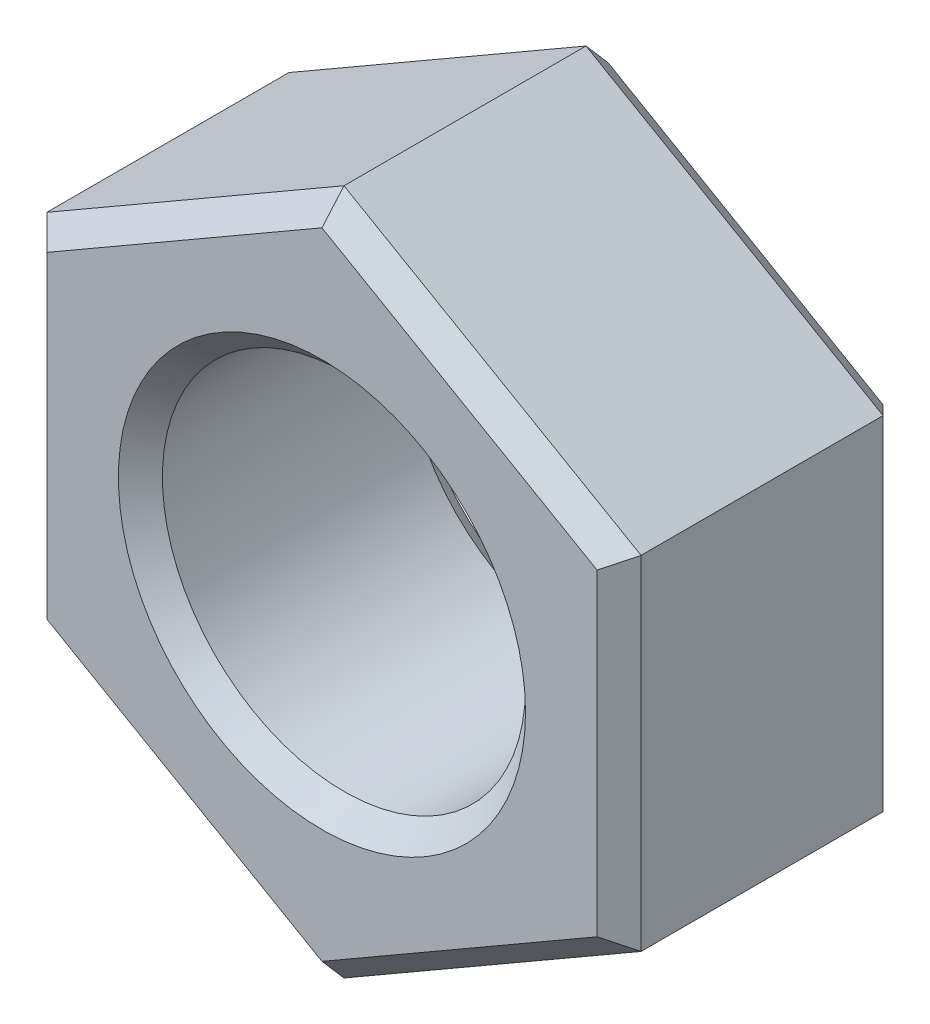
ISO-10303-21;
HEADER;
FILE_DESCRIPTION(('STEP AP214'),'2;1');
FILE_NAME('part.step','',(''),(''),'','','');
FILE_SCHEMA(('AUTOMOTIVE_DESIGN { 1 0 10303 214 1 1 1 1 }'));
ENDSEC;
DATA;
#1=APPLICATION_CONTEXT('core data for automotive mechanical design processes');
#2=APPLICATION_PROTOCOL_DEFINITION('international standard','automotive_design',2000,#1);
#3=PRODUCT_CONTEXT('',#1,'mechanical');
#4=PRODUCT('Part','Part','',(#3));
#5=PRODUCT_RELATED_PRODUCT_CATEGORY('part','',(#4));
#6=PRODUCT_DEFINITION_FORMATION('','',#4);
#7=PRODUCT_DEFINITION_CONTEXT('part definition',#1,'design');
#8=PRODUCT_DEFINITION('design','',#6,#7);
#9=PRODUCT_DEFINITION_SHAPE('','',#8);
#10=(LENGTH_UNIT() NAMED_UNIT(*) SI_UNIT(.MILLI.,.METRE.));
#11=(NAMED_UNIT(*) PLANE_ANGLE_UNIT() SI_UNIT($,.RADIAN.));
#12=(NAMED_UNIT(*) SI_UNIT($,.STERADIAN.) SOLID_ANGLE_UNIT());
#13=UNCERTAINTY_MEASURE_WITH_UNIT(LENGTH_MEASURE(1.E-05),#10,'distance_accuracy_value','');
#14=(GEOMETRIC_REPRESENTATION_CONTEXT(3) GLOBAL_UNCERTAINTY_ASSIGNED_CONTEXT((#13)) GLOBAL_UNIT_ASSIGNED_CONTEXT((#10,
#11,#12)) REPRESENTATION_CONTEXT('',''));
#15=CARTESIAN_POINT('',(0.,0.,0.));
#16=DIRECTION('',(0.,0.,1.));
#17=DIRECTION('',(1.,0.,0.));
#18=AXIS2_PLACEMENT_3D('',#15,#16,#17);
#19=CARTESIAN_POINT('',(0.,0.,1.3));
#20=DIRECTION('',(0.,0.,1.));
#21=DIRECTION('',(1.,0.,0.));
#22=AXIS2_PLACEMENT_3D('',#19,#20,#21);
#23=PLANE('',#22);
#24=CARTESIAN_POINT('',(0.,0.,1.3));
#25=DIRECTION('',(0.,0.,1.));
#26=DIRECTION('',(1.,0.,0.));
#27=AXIS2_PLACEMENT_3D('',#24,#25,#26);
#28=CIRCLE('',#27,1.85);
#29=CARTESIAN_POINT('',(1.85,0.,1.3));
#30=VERTEX_POINT('',#29);
#31=EDGE_CURVE('E11',#30,#30,#28,.F.);
#32=ORIENTED_EDGE('',*,*,#31,.T.);
#33=EDGE_LOOP('',(#32));
#34=FACE_BOUND('',#33,.T.);
#35=DIRECTION('',(0.,-1.,0.));
#36=VECTOR('',#35,1.);
#37=CARTESIAN_POINT('',(-2.5,-1.55884572681199,1.3));
#38=LINE('',#37,#36);
#39=CARTESIAN_POINT('',(-2.5,1.44337567297406,1.3));
#40=VERTEX_POINT('',#39);
#41=CARTESIAN_POINT('',(-2.5,-1.44337567297407,1.3));
#42=VERTEX_POINT('',#41);
#43=EDGE_CURVE('E61',#40,#42,#38,.T.);
#44=ORIENTED_EDGE('',*,*,#43,.T.);
#45=DIRECTION('',(0.866025403784439,-0.5,0.));
#46=VECTOR('',#45,1.);
#47=CARTESIAN_POINT('',(0.0999999999999997,-2.94448637286709,1.3));
#48=LINE('',#47,#46);
#49=CARTESIAN_POINT('',(0.,-2.88675134594813,1.3));
#50=VERTEX_POINT('',#49);
#51=EDGE_CURVE('E53',#42,#50,#48,.T.);
#52=ORIENTED_EDGE('',*,*,#51,.T.);
#53=DIRECTION('',(0.866025403784439,0.5,0.));
#54=VECTOR('',#53,1.);
#55=CARTESIAN_POINT('',(2.6,-1.3856406460551,1.3));
#56=LINE('',#55,#54);
#57=CARTESIAN_POINT('',(2.5,-1.44337567297406,1.3));
#58=VERTEX_POINT('',#57);
#59=EDGE_CURVE('E221',#50,#58,#56,.T.);
#60=ORIENTED_EDGE('',*,*,#59,.T.);
#61=DIRECTION('',(0.,1.,0.));
#62=VECTOR('',#61,1.);
#63=CARTESIAN_POINT('',(2.5,1.55884572681199,1.3));
#64=LINE('',#63,#62);
#65=CARTESIAN_POINT('',(2.5,1.44337567297407,1.3));
#66=VERTEX_POINT('',#65);
#67=EDGE_CURVE('E223',#58,#66,#64,.T.);
#68=ORIENTED_EDGE('',*,*,#67,.T.);
#69=DIRECTION('',(-0.866025403784439,0.5,0.));
#70=VECTOR('',#69,1.);
#71=CARTESIAN_POINT('',(-0.100000000000001,2.94448637286709,1.3));
#72=LINE('',#71,#70);
#73=CARTESIAN_POINT('',(0.,2.88675134594813,1.3));
#74=VERTEX_POINT('',#73);
#75=EDGE_CURVE('E226',#66,#74,#72,.T.);
#76=ORIENTED_EDGE('',*,*,#75,.T.);
#77=DIRECTION('',(-0.866025403784439,-0.5,0.));
#78=VECTOR('',#77,1.);
#79=CARTESIAN_POINT('',(-2.6,1.3856406460551,1.3));
#80=LINE('',#79,#78);
#81=EDGE_CURVE('E66',#74,#40,#80,.T.);
#82=ORIENTED_EDGE('',*,*,#81,.T.);
#83=EDGE_LOOP('',(#44,#52,#60,#68,#76,#82));
#84=FACE_BOUND('',#83,.T.);
#85=ADVANCED_FACE('F42',(#34,#84),#23,.T.);
#86=CARTESIAN_POINT('',(0.,0.,-1.3));
#87=DIRECTION('',(0.,0.,1.));
#88=DIRECTION('',(1.,0.,0.));
#89=AXIS2_PLACEMENT_3D('',#86,#87,#88);
#90=PLANE('',#89);
#91=CARTESIAN_POINT('',(0.,0.,-1.3));
#92=DIRECTION('',(0.,0.,1.));
#93=DIRECTION('',(1.,0.,0.));
#94=AXIS2_PLACEMENT_3D('',#91,#92,#93);
#95=CIRCLE('',#94,1.85);
#96=CARTESIAN_POINT('',(1.85,0.,-1.3));
#97=VERTEX_POINT('',#96);
#98=EDGE_CURVE('E165',#97,#97,#95,.T.);
#99=ORIENTED_EDGE('',*,*,#98,.T.);
#100=EDGE_LOOP('',(#99));
#101=FACE_BOUND('',#100,.T.);
#102=DIRECTION('',(0.866025403784439,-0.5,0.));
#103=VECTOR('',#102,1.);
#104=CARTESIAN_POINT('',(1.25,2.1650635094611,-1.3));
#105=LINE('',#104,#103);
#106=CARTESIAN_POINT('',(0.,2.88675134594813,-1.3));
#107=VERTEX_POINT('',#106);
#108=CARTESIAN_POINT('',(2.5,1.44337567297407,-1.3));
#109=VERTEX_POINT('',#108);
#110=EDGE_CURVE('E163',#107,#109,#105,.T.);
#111=ORIENTED_EDGE('',*,*,#110,.T.);
#112=DIRECTION('',(0.,-1.,0.));
#113=VECTOR('',#112,1.);
#114=CARTESIAN_POINT('',(2.5,0.,-1.3));
#115=LINE('',#114,#113);
#116=CARTESIAN_POINT('',(2.5,-1.44337567297407,-1.3));
#117=VERTEX_POINT('',#116);
#118=EDGE_CURVE('E140',#109,#117,#115,.T.);
#119=ORIENTED_EDGE('',*,*,#118,.T.);
#120=DIRECTION('',(-0.866025403784439,-0.5,0.));
#121=VECTOR('',#120,1.);
#122=CARTESIAN_POINT('',(1.25,-2.1650635094611,-1.3));
#123=LINE('',#122,#121);
#124=CARTESIAN_POINT('',(0.,-2.88675134594813,-1.3));
#125=VERTEX_POINT('',#124);
#126=EDGE_CURVE('E151',#117,#125,#123,.T.);
#127=ORIENTED_EDGE('',*,*,#126,.T.);
#128=DIRECTION('',(-0.866025403784439,0.5,0.));
#129=VECTOR('',#128,1.);
#130=CARTESIAN_POINT('',(-1.25,-2.1650635094611,-1.3));
#131=LINE('',#130,#129);
#132=CARTESIAN_POINT('',(-2.5,-1.44337567297407,-1.3));
#133=VERTEX_POINT('',#132);
#134=EDGE_CURVE('E158',#125,#133,#131,.T.);
#135=ORIENTED_EDGE('',*,*,#134,.T.);
#136=DIRECTION('',(0.,1.,0.));
#137=VECTOR('',#136,1.);
#138=CARTESIAN_POINT('',(-2.5,0.,-1.3));
#139=LINE('',#138,#137);
#140=CARTESIAN_POINT('',(-2.5,1.44337567297406,-1.3));
#141=VERTEX_POINT('',#140);
#142=EDGE_CURVE('E302',#133,#141,#139,.T.);
#143=ORIENTED_EDGE('',*,*,#142,.T.);
#144=DIRECTION('',(0.866025403784439,0.5,0.));
#145=VECTOR('',#144,1.);
#146=CARTESIAN_POINT('',(-1.25,2.1650635094611,-1.3));
#147=LINE('',#146,#145);
#148=EDGE_CURVE('E174',#141,#107,#147,.T.);
#149=ORIENTED_EDGE('',*,*,#148,.T.);
#150=EDGE_LOOP('',(#111,#119,#127,#135,#143,#149));
#151=FACE_BOUND('',#150,.T.);
#152=ADVANCED_FACE('F161',(#101,#151),#90,.F.);
#153=CARTESIAN_POINT('',(0.,-3.11769145362398,1.3));
#154=DIRECTION('',(-0.5,0.866025403784439,0.));
#155=DIRECTION('',(-0.866025403784439,-0.5,0.));
#156=AXIS2_PLACEMENT_3D('',#153,#154,#155);
#157=PLANE('',#156);
#158=DIRECTION('',(0.,0.,-1.));
#159=VECTOR('',#158,1.);
#160=CARTESIAN_POINT('',(0.,-3.11769145362398,1.3));
#161=LINE('',#160,#159);
#162=CARTESIAN_POINT('',(0.,-3.11769145362398,1.1));
#163=VERTEX_POINT('',#162);
#164=CARTESIAN_POINT('',(0.,-3.11769145362398,-1.1));
#165=VERTEX_POINT('',#164);
#166=EDGE_CURVE('E250',#163,#165,#161,.T.);
#167=ORIENTED_EDGE('',*,*,#166,.T.);
#168=DIRECTION('',(0.866025403784439,0.5,0.));
#169=VECTOR('',#168,1.);
#170=CARTESIAN_POINT('',(0.,-3.11769145362398,-1.1));
#171=LINE('',#170,#169);
#172=CARTESIAN_POINT('',(2.7,-1.55884572681199,-1.1));
#173=VERTEX_POINT('',#172);
#174=EDGE_CURVE('E218',#165,#173,#171,.T.);
#175=ORIENTED_EDGE('',*,*,#174,.T.);
#176=DIRECTION('',(0.,0.,-1.));
#177=VECTOR('',#176,1.);
#178=CARTESIAN_POINT('',(2.7,-1.55884572681199,1.3));
#179=LINE('',#178,#177);
#180=CARTESIAN_POINT('',(2.7,-1.55884572681199,1.1));
#181=VERTEX_POINT('',#180);
#182=EDGE_CURVE('E159',#181,#173,#179,.T.);
#183=ORIENTED_EDGE('',*,*,#182,.F.);
#184=DIRECTION('',(-0.866025403784439,-0.5,0.));
#185=VECTOR('',#184,1.);
#186=CARTESIAN_POINT('',(0.,-3.11769145362398,1.1));
#187=LINE('',#186,#185);
#188=EDGE_CURVE('E215',#181,#163,#187,.T.);
#189=ORIENTED_EDGE('',*,*,#188,.T.);
#190=EDGE_LOOP('',(#167,#175,#183,#189));
#191=FACE_BOUND('',#190,.T.);
#192=ADVANCED_FACE('F331',(#191),#157,.F.);
#193=CARTESIAN_POINT('',(2.7,-1.55884572681199,1.3));
#194=DIRECTION('',(-1.,0.,0.));
#195=DIRECTION('',(0.,-1.,0.));
#196=AXIS2_PLACEMENT_3D('',#193,#194,#195);
#197=PLANE('',#196);
#198=ORIENTED_EDGE('',*,*,#182,.T.);
#199=DIRECTION('',(0.,1.,0.));
#200=VECTOR('',#199,1.);
#201=CARTESIAN_POINT('',(2.7,-1.55884572681199,-1.1));
#202=LINE('',#201,#200);
#203=CARTESIAN_POINT('',(2.7,1.55884572681199,-1.1));
#204=VERTEX_POINT('',#203);
#205=EDGE_CURVE('E143',#173,#204,#202,.T.);
#206=ORIENTED_EDGE('',*,*,#205,.T.);
#207=DIRECTION('',(0.,0.,-1.));
#208=VECTOR('',#207,1.);
#209=CARTESIAN_POINT('',(2.7,1.55884572681199,1.3));
#210=LINE('',#209,#208);
#211=CARTESIAN_POINT('',(2.7,1.55884572681199,1.1));
#212=VERTEX_POINT('',#211);
#213=EDGE_CURVE('E285',#212,#204,#210,.T.);
#214=ORIENTED_EDGE('',*,*,#213,.F.);
#215=DIRECTION('',(0.,-1.,0.));
#216=VECTOR('',#215,1.);
#217=CARTESIAN_POINT('',(2.7,-1.55884572681199,1.1));
#218=LINE('',#217,#216);
#219=EDGE_CURVE('E185',#212,#181,#218,.T.);
#220=ORIENTED_EDGE('',*,*,#219,.T.);
#221=EDGE_LOOP('',(#198,#206,#214,#220));
#222=FACE_BOUND('',#221,.T.);
#223=ADVANCED_FACE('F290',(#222),#197,.F.);
#224=CARTESIAN_POINT('',(2.7,1.55884572681199,1.3));
#225=DIRECTION('',(-0.5,-0.866025403784439,0.));
#226=DIRECTION('',(0.866025403784439,-0.5,0.));
#227=AXIS2_PLACEMENT_3D('',#224,#225,#226);
#228=PLANE('',#227);
#229=ORIENTED_EDGE('',*,*,#213,.T.);
#230=DIRECTION('',(-0.866025403784439,0.5,0.));
#231=VECTOR('',#230,1.);
#232=CARTESIAN_POINT('',(2.7,1.55884572681199,-1.1));
#233=LINE('',#232,#231);
#234=CARTESIAN_POINT('',(0.,3.11769145362398,-1.1));
#235=VERTEX_POINT('',#234);
#236=EDGE_CURVE('E193',#204,#235,#233,.T.);
#237=ORIENTED_EDGE('',*,*,#236,.T.);
#238=DIRECTION('',(0.,0.,-1.));
#239=VECTOR('',#238,1.);
#240=CARTESIAN_POINT('',(0.,3.11769145362398,1.3));
#241=LINE('',#240,#239);
#242=CARTESIAN_POINT('',(0.,3.11769145362398,1.1));
#243=VERTEX_POINT('',#242);
#244=EDGE_CURVE('E287',#243,#235,#241,.T.);
#245=ORIENTED_EDGE('',*,*,#244,.F.);
#246=DIRECTION('',(0.866025403784439,-0.5,0.));
#247=VECTOR('',#246,1.);
#248=CARTESIAN_POINT('',(2.7,1.55884572681199,1.1));
#249=LINE('',#248,#247);
#250=EDGE_CURVE('E190',#243,#212,#249,.T.);
#251=ORIENTED_EDGE('',*,*,#250,.T.);
#252=EDGE_LOOP('',(#229,#237,#245,#251));
#253=FACE_BOUND('',#252,.T.);
#254=ADVANCED_FACE('F284',(#253),#228,.F.);
#255=CARTESIAN_POINT('',(0.,3.11769145362398,1.3));
#256=DIRECTION('',(0.5,-0.866025403784439,0.));
#257=DIRECTION('',(0.866025403784439,0.5,0.));
#258=AXIS2_PLACEMENT_3D('',#255,#256,#257);
#259=PLANE('',#258);
#260=ORIENTED_EDGE('',*,*,#244,.T.);
#261=DIRECTION('',(-0.866025403784439,-0.5,0.));
#262=VECTOR('',#261,1.);
#263=CARTESIAN_POINT('',(0.,3.11769145362398,-1.1));
#264=LINE('',#263,#262);
#265=CARTESIAN_POINT('',(-2.7,1.55884572681199,-1.1));
#266=VERTEX_POINT('',#265);
#267=EDGE_CURVE('E199',#235,#266,#264,.T.);
#268=ORIENTED_EDGE('',*,*,#267,.T.);
#269=DIRECTION('',(0.,0.,-1.));
#270=VECTOR('',#269,1.);
#271=CARTESIAN_POINT('',(-2.7,1.55884572681199,1.3));
#272=LINE('',#271,#270);
#273=CARTESIAN_POINT('',(-2.7,1.55884572681199,1.1));
#274=VERTEX_POINT('',#273);
#275=EDGE_CURVE('E296',#274,#266,#272,.T.);
#276=ORIENTED_EDGE('',*,*,#275,.F.);
#277=DIRECTION('',(0.866025403784439,0.5,0.));
#278=VECTOR('',#277,1.);
#279=CARTESIAN_POINT('',(0.,3.11769145362398,1.1));
#280=LINE('',#279,#278);
#281=EDGE_CURVE('E196',#274,#243,#280,.T.);
#282=ORIENTED_EDGE('',*,*,#281,.T.);
#283=EDGE_LOOP('',(#260,#268,#276,#282));
#284=FACE_BOUND('',#283,.T.);
#285=ADVANCED_FACE('F317',(#284),#259,.F.);
#286=CARTESIAN_POINT('',(-2.7,1.55884572681199,1.3));
#287=DIRECTION('',(1.,0.,0.));
#288=DIRECTION('',(0.,0.,-1.));
#289=AXIS2_PLACEMENT_3D('',#286,#287,#288);
#290=PLANE('',#289);
#291=ORIENTED_EDGE('',*,*,#275,.T.);
#292=DIRECTION('',(0.,-1.,0.));
#293=VECTOR('',#292,1.);
#294=CARTESIAN_POINT('',(-2.7,1.55884572681199,-1.1));
#295=LINE('',#294,#293);
#296=CARTESIAN_POINT('',(-2.7,-1.55884572681199,-1.1));
#297=VERTEX_POINT('',#296);
#298=EDGE_CURVE('E205',#266,#297,#295,.T.);
#299=ORIENTED_EDGE('',*,*,#298,.T.);
#300=DIRECTION('',(0.,0.,-1.));
#301=VECTOR('',#300,1.);
#302=CARTESIAN_POINT('',(-2.7,-1.55884572681199,1.3));
#303=LINE('',#302,#301);
#304=CARTESIAN_POINT('',(-2.7,-1.55884572681199,1.1));
#305=VERTEX_POINT('',#304);
#306=EDGE_CURVE('E323',#305,#297,#303,.T.);
#307=ORIENTED_EDGE('',*,*,#306,.F.);
#308=DIRECTION('',(0.,1.,0.));
#309=VECTOR('',#308,1.);
#310=CARTESIAN_POINT('',(-2.7,1.55884572681199,1.1));
#311=LINE('',#310,#309);
#312=EDGE_CURVE('E202',#305,#274,#311,.T.);
#313=ORIENTED_EDGE('',*,*,#312,.T.);
#314=EDGE_LOOP('',(#291,#299,#307,#313));
#315=FACE_BOUND('',#314,.T.);
#316=ADVANCED_FACE('F342',(#315),#290,.F.);
#317=CARTESIAN_POINT('',(-2.7,-1.55884572681199,1.3));
#318=DIRECTION('',(0.5,0.866025403784439,0.));
#319=DIRECTION('',(-0.866025403784439,0.5,0.));
#320=AXIS2_PLACEMENT_3D('',#317,#318,#319);
#321=PLANE('',#320);
#322=ORIENTED_EDGE('',*,*,#306,.T.);
#323=DIRECTION('',(0.866025403784439,-0.5,0.));
#324=VECTOR('',#323,1.);
#325=CARTESIAN_POINT('',(-2.7,-1.55884572681199,-1.1));
#326=LINE('',#325,#324);
#327=EDGE_CURVE('E212',#297,#165,#326,.T.);
#328=ORIENTED_EDGE('',*,*,#327,.T.);
#329=ORIENTED_EDGE('',*,*,#166,.F.);
#330=DIRECTION('',(-0.866025403784439,0.5,0.));
#331=VECTOR('',#330,1.);
#332=CARTESIAN_POINT('',(-2.7,-1.55884572681199,1.1));
#333=LINE('',#332,#331);
#334=EDGE_CURVE('E208',#163,#305,#333,.T.);
#335=ORIENTED_EDGE('',*,*,#334,.T.);
#336=EDGE_LOOP('',(#322,#328,#329,#335));
#337=FACE_BOUND('',#336,.T.);
#338=ADVANCED_FACE('F343',(#337),#321,.F.);
#339=CARTESIAN_POINT('',(0.,0.,1.3));
#340=DIRECTION('',(0.,0.,-1.));
#341=DIRECTION('',(-1.,0.,0.));
#342=AXIS2_PLACEMENT_3D('',#339,#340,#341);
#343=CYLINDRICAL_SURFACE('',#342,1.65);
#344=CARTESIAN_POINT('',(0.,0.,-1.1));
#345=DIRECTION('',(0.,0.,1.));
#346=DIRECTION('',(1.,0.,0.));
#347=AXIS2_PLACEMENT_3D('',#344,#345,#346);
#348=CIRCLE('',#347,1.65);
#349=CARTESIAN_POINT('',(1.65,0.,-1.1));
#350=VERTEX_POINT('',#349);
#351=EDGE_CURVE('E181',#350,#350,#348,.F.);
#352=ORIENTED_EDGE('',*,*,#351,.T.);
#353=EDGE_LOOP('',(#352));
#354=FACE_BOUND('',#353,.T.);
#355=CARTESIAN_POINT('',(0.,0.,1.1));
#356=DIRECTION('',(0.,0.,1.));
#357=DIRECTION('',(1.,0.,0.));
#358=AXIS2_PLACEMENT_3D('',#355,#356,#357);
#359=CIRCLE('',#358,1.65);
#360=CARTESIAN_POINT('',(1.65,0.,1.1));
#361=VERTEX_POINT('',#360);
#362=EDGE_CURVE('E171',#361,#361,#359,.T.);
#363=ORIENTED_EDGE('',*,*,#362,.T.);
#364=EDGE_LOOP('',(#363));
#365=FACE_BOUND('',#364,.T.);
#366=ADVANCED_FACE('F362',(#354,#365),#343,.F.);
#367=CARTESIAN_POINT('',(0.,0.,-1.3));
#368=DIRECTION('',(0.,0.,-1.));
#369=DIRECTION('',(-1.,0.,0.));
#370=AXIS2_PLACEMENT_3D('',#367,#368,#369);
#371=CONICAL_SURFACE('',#370,1.85,0.785398163397446);
#372=ORIENTED_EDGE('',*,*,#351,.F.);
#373=EDGE_LOOP('',(#372));
#374=FACE_BOUND('',#373,.T.);
#375=ORIENTED_EDGE('',*,*,#98,.F.);
#376=EDGE_LOOP('',(#375));
#377=FACE_BOUND('',#376,.T.);
#378=ADVANCED_FACE('F377',(#374,#377),#371,.F.);
#379=CARTESIAN_POINT('',(-2.7,1.55884572681199,-1.1));
#380=DIRECTION('',(0.707106781186546,0.,0.707106781186549));
#381=DIRECTION('',(0.,-1.,0.));
#382=AXIS2_PLACEMENT_3D('',#379,#380,#381);
#383=PLANE('',#382);
#384=DIRECTION('',(0.654653670707978,-0.377964473009229,-0.654653670707975));
#385=VECTOR('',#384,1.);
#386=CARTESIAN_POINT('',(-2.7,1.55884572681199,-1.1));
#387=LINE('',#386,#385);
#388=EDGE_CURVE('E242',#141,#266,#387,.F.);
#389=ORIENTED_EDGE('',*,*,#388,.F.);
#390=ORIENTED_EDGE('',*,*,#142,.F.);
#391=DIRECTION('',(0.654653670707979,0.377964473009227,-0.654653670707976));
#392=VECTOR('',#391,1.);
#393=CARTESIAN_POINT('',(-2.7,-1.55884572681199,-1.1));
#394=LINE('',#393,#392);
#395=EDGE_CURVE('E246',#297,#133,#394,.T.);
#396=ORIENTED_EDGE('',*,*,#395,.F.);
#397=ORIENTED_EDGE('',*,*,#298,.F.);
#398=EDGE_LOOP('',(#389,#390,#396,#397));
#399=FACE_BOUND('',#398,.T.);
#400=ADVANCED_FACE('F340',(#399),#383,.F.);
#401=CARTESIAN_POINT('',(-2.7,-1.55884572681199,-1.1));
#402=DIRECTION('',(0.353553390593273,0.612372435695793,0.707106781186549));
#403=DIRECTION('',(0.866025403784439,-0.5,0.));
#404=AXIS2_PLACEMENT_3D('',#401,#402,#403);
#405=PLANE('',#404);
#406=ORIENTED_EDGE('',*,*,#395,.T.);
#407=ORIENTED_EDGE('',*,*,#134,.F.);
#408=DIRECTION('',(0.,0.755928946018456,-0.654653670707975));
#409=VECTOR('',#408,1.);
#410=CARTESIAN_POINT('',(0.,-3.11769145362398,-1.1));
#411=LINE('',#410,#409);
#412=EDGE_CURVE('E154',#165,#125,#411,.T.);
#413=ORIENTED_EDGE('',*,*,#412,.F.);
#414=ORIENTED_EDGE('',*,*,#327,.F.);
#415=EDGE_LOOP('',(#406,#407,#413,#414));
#416=FACE_BOUND('',#415,.T.);
#417=ADVANCED_FACE('F337',(#416),#405,.F.);
#418=CARTESIAN_POINT('',(0.,3.11769145362398,-1.1));
#419=DIRECTION('',(0.353553390593273,-0.612372435695792,0.70710678118655));
#420=DIRECTION('',(-0.866025403784439,-0.5,0.));
#421=AXIS2_PLACEMENT_3D('',#418,#419,#420);
#422=PLANE('',#421);
#423=ORIENTED_EDGE('',*,*,#388,.T.);
#424=ORIENTED_EDGE('',*,*,#267,.F.);
#425=DIRECTION('',(0.,-0.755928946018457,-0.654653670707975));
#426=VECTOR('',#425,1.);
#427=CARTESIAN_POINT('',(0.,3.11769145362398,-1.1));
#428=LINE('',#427,#426);
#429=EDGE_CURVE('E147',#107,#235,#428,.F.);
#430=ORIENTED_EDGE('',*,*,#429,.F.);
#431=ORIENTED_EDGE('',*,*,#148,.F.);
#432=EDGE_LOOP('',(#423,#424,#430,#431));
#433=FACE_BOUND('',#432,.T.);
#434=ADVANCED_FACE('F312',(#433),#422,.F.);
#435=CARTESIAN_POINT('',(0.,-3.11769145362398,-1.1));
#436=DIRECTION('',(-0.353553390593273,0.612372435695793,0.707106781186549));
#437=DIRECTION('',(0.866025403784439,0.5,0.));
#438=AXIS2_PLACEMENT_3D('',#435,#436,#437);
#439=PLANE('',#438);
#440=ORIENTED_EDGE('',*,*,#412,.T.);
#441=ORIENTED_EDGE('',*,*,#126,.F.);
#442=DIRECTION('',(0.654653670707978,-0.377964473009228,0.654653670707975));
#443=VECTOR('',#442,1.);
#444=CARTESIAN_POINT('',(1.92857142857143,-1.11346123343714,-1.87142857142857));
#445=LINE('',#444,#443);
#446=EDGE_CURVE('E136',#173,#117,#445,.F.);
#447=ORIENTED_EDGE('',*,*,#446,.F.);
#448=ORIENTED_EDGE('',*,*,#174,.F.);
#449=EDGE_LOOP('',(#440,#441,#447,#448));
#450=FACE_BOUND('',#449,.T.);
#451=ADVANCED_FACE('F152',(#450),#439,.F.);
#452=CARTESIAN_POINT('',(2.7,1.55884572681199,-1.1));
#453=DIRECTION('',(-0.353553390593273,-0.612372435695793,0.707106781186549));
#454=DIRECTION('',(-0.866025403784439,0.5,0.));
#455=AXIS2_PLACEMENT_3D('',#452,#453,#454);
#456=PLANE('',#455);
#457=ORIENTED_EDGE('',*,*,#429,.T.);
#458=ORIENTED_EDGE('',*,*,#236,.F.);
#459=DIRECTION('',(-0.654653670707978,-0.377964473009229,-0.654653670707975));
#460=VECTOR('',#459,1.);
#461=CARTESIAN_POINT('',(2.7,1.55884572681199,-1.1));
#462=LINE('',#461,#460);
#463=EDGE_CURVE('E148',#109,#204,#462,.F.);
#464=ORIENTED_EDGE('',*,*,#463,.F.);
#465=ORIENTED_EDGE('',*,*,#110,.F.);
#466=EDGE_LOOP('',(#457,#458,#464,#465));
#467=FACE_BOUND('',#466,.T.);
#468=ADVANCED_FACE('F315',(#467),#456,.F.);
#469=CARTESIAN_POINT('',(2.7,-1.55884572681199,-1.1));
#470=DIRECTION('',(-0.707106781186546,0.,0.707106781186549));
#471=DIRECTION('',(0.,1.,0.));
#472=AXIS2_PLACEMENT_3D('',#469,#470,#471);
#473=PLANE('',#472);
#474=ORIENTED_EDGE('',*,*,#446,.T.);
#475=ORIENTED_EDGE('',*,*,#118,.F.);
#476=ORIENTED_EDGE('',*,*,#463,.T.);
#477=ORIENTED_EDGE('',*,*,#205,.F.);
#478=EDGE_LOOP('',(#474,#475,#476,#477));
#479=FACE_BOUND('',#478,.T.);
#480=ADVANCED_FACE('F138',(#479),#473,.F.);
#481=CARTESIAN_POINT('',(0.,0.,1.1));
#482=DIRECTION('',(0.,0.,1.));
#483=DIRECTION('',(1.,0.,0.));
#484=AXIS2_PLACEMENT_3D('',#481,#482,#483);
#485=CONICAL_SURFACE('',#484,1.65,0.785398163397453);
#486=ORIENTED_EDGE('',*,*,#31,.F.);
#487=EDGE_LOOP('',(#486));
#488=FACE_BOUND('',#487,.T.);
#489=ORIENTED_EDGE('',*,*,#362,.F.);
#490=EDGE_LOOP('',(#489));
#491=FACE_BOUND('',#490,.T.);
#492=ADVANCED_FACE('F391',(#488,#491),#485,.F.);
#493=CARTESIAN_POINT('',(1.25,2.1650635094611,1.3));
#494=DIRECTION('',(0.353553390593274,0.612372435695794,0.707106781186548));
#495=DIRECTION('',(0.866025403784439,-0.5,0.));
#496=AXIS2_PLACEMENT_3D('',#493,#494,#495);
#497=PLANE('',#496);
#498=DIRECTION('',(-0.654653670707977,-0.377964473009228,0.654653670707977));
#499=VECTOR('',#498,1.);
#500=CARTESIAN_POINT('',(2.14285714285714,1.23717914826348,1.65714285714286));
#501=LINE('',#500,#499);
#502=EDGE_CURVE('E264',#212,#66,#501,.T.);
#503=ORIENTED_EDGE('',*,*,#502,.F.);
#504=ORIENTED_EDGE('',*,*,#250,.F.);
#505=DIRECTION('',(0.,-0.755928946018455,0.654653670707977));
#506=VECTOR('',#505,1.);
#507=CARTESIAN_POINT('',(0.,2.47435829652697,1.65714285714286));
#508=LINE('',#507,#506);
#509=EDGE_CURVE('E47',#74,#243,#508,.F.);
#510=ORIENTED_EDGE('',*,*,#509,.F.);
#511=ORIENTED_EDGE('',*,*,#75,.F.);
#512=EDGE_LOOP('',(#503,#504,#510,#511));
#513=FACE_BOUND('',#512,.T.);
#514=ADVANCED_FACE('F45',(#513),#497,.T.);
#515=CARTESIAN_POINT('',(-1.25,2.1650635094611,1.3));
#516=DIRECTION('',(-0.353553390593273,0.612372435695794,0.707106781186548));
#517=DIRECTION('',(0.866025403784439,0.5,0.));
#518=AXIS2_PLACEMENT_3D('',#515,#516,#517);
#519=PLANE('',#518);
#520=ORIENTED_EDGE('',*,*,#509,.T.);
#521=ORIENTED_EDGE('',*,*,#281,.F.);
#522=DIRECTION('',(0.654653670707977,-0.377964473009229,0.654653670707977));
#523=VECTOR('',#522,1.);
#524=CARTESIAN_POINT('',(-2.14285714285714,1.23717914826348,1.65714285714286));
#525=LINE('',#524,#523);
#526=EDGE_CURVE('E261',#40,#274,#525,.F.);
#527=ORIENTED_EDGE('',*,*,#526,.F.);
#528=ORIENTED_EDGE('',*,*,#81,.F.);
#529=EDGE_LOOP('',(#520,#521,#527,#528));
#530=FACE_BOUND('',#529,.T.);
#531=ADVANCED_FACE('F276',(#530),#519,.T.);
#532=CARTESIAN_POINT('',(2.5,0.,1.3));
#533=DIRECTION('',(0.707106781186547,0.,0.707106781186547));
#534=DIRECTION('',(0.,-1.,0.));
#535=AXIS2_PLACEMENT_3D('',#532,#533,#534);
#536=PLANE('',#535);
#537=ORIENTED_EDGE('',*,*,#502,.T.);
#538=ORIENTED_EDGE('',*,*,#67,.F.);
#539=DIRECTION('',(-0.654653670707977,0.377964473009228,0.654653670707977));
#540=VECTOR('',#539,1.);
#541=CARTESIAN_POINT('',(2.14285714285714,-1.23717914826348,1.65714285714286));
#542=LINE('',#541,#540);
#543=EDGE_CURVE('E257',#181,#58,#542,.T.);
#544=ORIENTED_EDGE('',*,*,#543,.F.);
#545=ORIENTED_EDGE('',*,*,#219,.F.);
#546=EDGE_LOOP('',(#537,#538,#544,#545));
#547=FACE_BOUND('',#546,.T.);
#548=ADVANCED_FACE('F437',(#547),#536,.T.);
#549=CARTESIAN_POINT('',(-2.5,0.,1.3));
#550=DIRECTION('',(-0.707106781186547,0.,0.707106781186547));
#551=DIRECTION('',(0.,1.,0.));
#552=AXIS2_PLACEMENT_3D('',#549,#550,#551);
#553=PLANE('',#552);
#554=ORIENTED_EDGE('',*,*,#526,.T.);
#555=ORIENTED_EDGE('',*,*,#312,.F.);
#556=DIRECTION('',(0.654653670707977,0.377964473009227,0.654653670707977));
#557=VECTOR('',#556,1.);
#558=CARTESIAN_POINT('',(-2.14285714285714,-1.23717914826349,1.65714285714286));
#559=LINE('',#558,#557);
#560=EDGE_CURVE('E254',#42,#305,#559,.F.);
#561=ORIENTED_EDGE('',*,*,#560,.F.);
#562=ORIENTED_EDGE('',*,*,#43,.F.);
#563=EDGE_LOOP('',(#554,#555,#561,#562));
#564=FACE_BOUND('',#563,.T.);
#565=ADVANCED_FACE('F431',(#564),#553,.T.);
#566=CARTESIAN_POINT('',(1.25,-2.1650635094611,1.3));
#567=DIRECTION('',(0.353553390593274,-0.612372435695794,0.707106781186548));
#568=DIRECTION('',(-0.866025403784439,-0.5,0.));
#569=AXIS2_PLACEMENT_3D('',#566,#567,#568);
#570=PLANE('',#569);
#571=ORIENTED_EDGE('',*,*,#543,.T.);
#572=ORIENTED_EDGE('',*,*,#59,.F.);
#573=DIRECTION('',(0.,-0.755928946018455,-0.654653670707977));
#574=VECTOR('',#573,1.);
#575=CARTESIAN_POINT('',(0.,-2.47435829652697,1.65714285714286));
#576=LINE('',#575,#574);
#577=EDGE_CURVE('E251',#163,#50,#576,.F.);
#578=ORIENTED_EDGE('',*,*,#577,.F.);
#579=ORIENTED_EDGE('',*,*,#188,.F.);
#580=EDGE_LOOP('',(#571,#572,#578,#579));
#581=FACE_BOUND('',#580,.T.);
#582=ADVANCED_FACE('F351',(#581),#570,.T.);
#583=CARTESIAN_POINT('',(-1.25,-2.1650635094611,1.3));
#584=DIRECTION('',(-0.353553390593274,-0.612372435695795,0.707106781186547));
#585=DIRECTION('',(-0.866025403784439,0.5,0.));
#586=AXIS2_PLACEMENT_3D('',#583,#584,#585);
#587=PLANE('',#586);
#588=ORIENTED_EDGE('',*,*,#560,.T.);
#589=ORIENTED_EDGE('',*,*,#334,.F.);
#590=ORIENTED_EDGE('',*,*,#577,.T.);
#591=ORIENTED_EDGE('',*,*,#51,.F.);
#592=EDGE_LOOP('',(#588,#589,#590,#591));
#593=FACE_BOUND('',#592,.T.);
#594=ADVANCED_FACE('F346',(#593),#587,.T.);
#595=CLOSED_SHELL('',(#85,#152,#192,#223,#254,#285,#316,#338,#366,#378,#400,#417,#434,#451,#468,
#480,#492,#514,#531,#548,#565,#582,#594));
#596=MANIFOLD_SOLID_BREP('B2',#595);
#597=ADVANCED_BREP_SHAPE_REPRESENTATION('',(#18,#596),#14);
#598=SHAPE_DEFINITION_REPRESENTATION(#9,#597);
ENDSEC;
END-ISO-10303-21;
